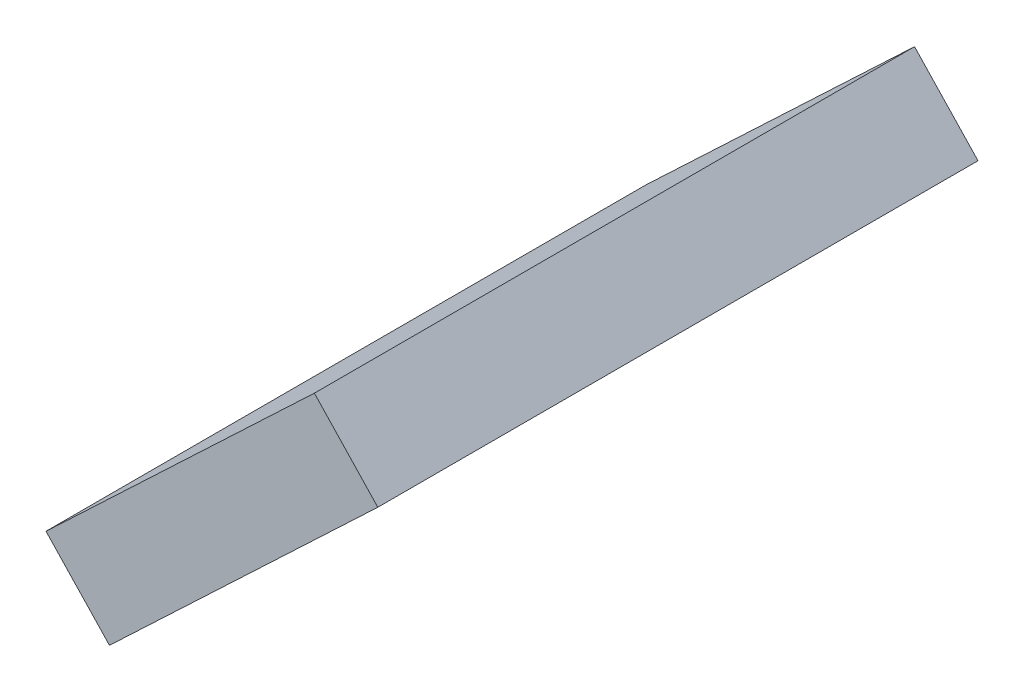
ISO-10303-21;
HEADER;
FILE_DESCRIPTION(('STEP AP214'),'2;1');
FILE_NAME('part.step','',(''),(''),'','','');
FILE_SCHEMA(('AUTOMOTIVE_DESIGN { 1 0 10303 214 1 1 1 1 }'));
ENDSEC;
DATA;
#1=APPLICATION_CONTEXT('core data for automotive mechanical design processes');
#2=APPLICATION_PROTOCOL_DEFINITION('international standard','automotive_design',2000,#1);
#3=PRODUCT_CONTEXT('',#1,'mechanical');
#4=PRODUCT('Part','Part','',(#3));
#5=PRODUCT_RELATED_PRODUCT_CATEGORY('part','',(#4));
#6=PRODUCT_DEFINITION_FORMATION('','',#4);
#7=PRODUCT_DEFINITION_CONTEXT('part definition',#1,'design');
#8=PRODUCT_DEFINITION('design','',#6,#7);
#9=PRODUCT_DEFINITION_SHAPE('','',#8);
#10=(LENGTH_UNIT() NAMED_UNIT(*) SI_UNIT(.MILLI.,.METRE.));
#11=(NAMED_UNIT(*) PLANE_ANGLE_UNIT() SI_UNIT($,.RADIAN.));
#12=(NAMED_UNIT(*) SI_UNIT($,.STERADIAN.) SOLID_ANGLE_UNIT());
#13=UNCERTAINTY_MEASURE_WITH_UNIT(LENGTH_MEASURE(1.E-05),#10,'distance_accuracy_value','');
#14=(GEOMETRIC_REPRESENTATION_CONTEXT(3) GLOBAL_UNCERTAINTY_ASSIGNED_CONTEXT((#13)) GLOBAL_UNIT_ASSIGNED_CONTEXT((#10,
#11,#12)) REPRESENTATION_CONTEXT('',''));
#15=CARTESIAN_POINT('',(0.,0.,0.));
#16=DIRECTION('',(0.,0.,1.));
#17=DIRECTION('',(1.,0.,0.));
#18=AXIS2_PLACEMENT_3D('',#15,#16,#17);
#19=CARTESIAN_POINT('',(-379.251734040544,-354.256359801674,130.));
#20=DIRECTION('',(0.726614577029218,0.687045308876096,0.));
#21=DIRECTION('',(-0.687045308876096,0.726614577029218,0.));
#22=AXIS2_PLACEMENT_3D('',#19,#20,#21);
#23=PLANE('',#22);
#24=DIRECTION('',(0.687045308876096,-0.726614577029218,0.));
#25=VECTOR('',#24,1.);
#26=CARTESIAN_POINT('',(-379.251734040544,-354.256359801674,0.));
#27=LINE('',#26,#25);
#28=CARTESIAN_POINT('',(-379.251734040544,-354.256359801674,0.));
#29=VERTEX_POINT('',#28);
#30=CARTESIAN_POINT('',(-365.510827863022,-368.788651342258,0.));
#31=VERTEX_POINT('',#30);
#32=EDGE_CURVE('E98',#29,#31,#27,.T.);
#33=ORIENTED_EDGE('',*,*,#32,.T.);
#34=DIRECTION('',(0.,0.,-1.));
#35=VECTOR('',#34,1.);
#36=CARTESIAN_POINT('',(-365.510827863022,-368.788651342258,130.));
#37=LINE('',#36,#35);
#38=CARTESIAN_POINT('',(-365.510827863022,-368.788651342258,130.));
#39=VERTEX_POINT('',#38);
#40=EDGE_CURVE('E11',#39,#31,#37,.T.);
#41=ORIENTED_EDGE('',*,*,#40,.F.);
#42=DIRECTION('',(0.687045308876096,-0.726614577029218,0.));
#43=VECTOR('',#42,1.);
#44=CARTESIAN_POINT('',(-379.251734040544,-354.256359801674,130.));
#45=LINE('',#44,#43);
#46=CARTESIAN_POINT('',(-379.251734040544,-354.256359801674,130.));
#47=VERTEX_POINT('',#46);
#48=EDGE_CURVE('E86',#47,#39,#45,.T.);
#49=ORIENTED_EDGE('',*,*,#48,.F.);
#50=DIRECTION('',(0.,0.,-1.));
#51=VECTOR('',#50,1.);
#52=CARTESIAN_POINT('',(-379.251734040544,-354.256359801674,130.));
#53=LINE('',#52,#51);
#54=EDGE_CURVE('E94',#47,#29,#53,.T.);
#55=ORIENTED_EDGE('',*,*,#54,.T.);
#56=EDGE_LOOP('',(#33,#41,#49,#55));
#57=FACE_BOUND('',#56,.T.);
#58=ADVANCED_FACE('F35',(#57),#23,.F.);
#59=CARTESIAN_POINT('',(-365.510827863022,-368.788651342258,130.));
#60=DIRECTION('',(-0.687045308876096,0.726614577029218,0.));
#61=DIRECTION('',(-0.726614577029218,-0.687045308876096,0.));
#62=AXIS2_PLACEMENT_3D('',#59,#60,#61);
#63=PLANE('',#62);
#64=DIRECTION('',(0.726614577029218,0.687045308876096,0.));
#65=VECTOR('',#64,1.);
#66=CARTESIAN_POINT('',(-365.510827863022,-368.788651342258,0.));
#67=LINE('',#66,#65);
#68=CARTESIAN_POINT('',(-307.381661700685,-313.82502663217,0.));
#69=VERTEX_POINT('',#68);
#70=EDGE_CURVE('E90',#31,#69,#67,.T.);
#71=ORIENTED_EDGE('',*,*,#70,.T.);
#72=DIRECTION('',(0.,0.,-1.));
#73=VECTOR('',#72,1.);
#74=CARTESIAN_POINT('',(-307.381661700685,-313.82502663217,130.));
#75=LINE('',#74,#73);
#76=CARTESIAN_POINT('',(-307.381661700685,-313.82502663217,130.));
#77=VERTEX_POINT('',#76);
#78=EDGE_CURVE('E43',#77,#69,#75,.T.);
#79=ORIENTED_EDGE('',*,*,#78,.F.);
#80=DIRECTION('',(0.726614577029218,0.687045308876096,0.));
#81=VECTOR('',#80,1.);
#82=CARTESIAN_POINT('',(-365.510827863022,-368.788651342258,130.));
#83=LINE('',#82,#81);
#84=EDGE_CURVE('E81',#39,#77,#83,.T.);
#85=ORIENTED_EDGE('',*,*,#84,.F.);
#86=ORIENTED_EDGE('',*,*,#40,.T.);
#87=EDGE_LOOP('',(#71,#79,#85,#86));
#88=FACE_BOUND('',#87,.T.);
#89=ADVANCED_FACE('F89',(#88),#63,.F.);
#90=CARTESIAN_POINT('',(-321.122567878206,-299.292735091586,130.));
#91=DIRECTION('',(-0.72661457702922,-0.687045308876094,0.));
#92=DIRECTION('',(0.687045308876095,-0.72661457702922,0.));
#93=AXIS2_PLACEMENT_3D('',#90,#91,#92);
#94=PLANE('',#93);
#95=DIRECTION('',(-0.687045308876095,0.72661457702922,0.));
#96=VECTOR('',#95,1.);
#97=CARTESIAN_POINT('',(-321.122567878206,-299.292735091586,0.));
#98=LINE('',#97,#96);
#99=CARTESIAN_POINT('',(-321.122567878206,-299.292735091586,0.));
#100=VERTEX_POINT('',#99);
#101=EDGE_CURVE('E68',#69,#100,#98,.T.);
#102=ORIENTED_EDGE('',*,*,#101,.T.);
#103=DIRECTION('',(0.,0.,-1.));
#104=VECTOR('',#103,1.);
#105=CARTESIAN_POINT('',(-321.122567878206,-299.292735091586,130.));
#106=LINE('',#105,#104);
#107=CARTESIAN_POINT('',(-321.122567878206,-299.292735091586,130.));
#108=VERTEX_POINT('',#107);
#109=EDGE_CURVE('E91',#108,#100,#106,.T.);
#110=ORIENTED_EDGE('',*,*,#109,.F.);
#111=DIRECTION('',(-0.687045308876095,0.72661457702922,0.));
#112=VECTOR('',#111,1.);
#113=CARTESIAN_POINT('',(-321.122567878206,-299.292735091586,130.));
#114=LINE('',#113,#112);
#115=EDGE_CURVE('E84',#77,#108,#114,.T.);
#116=ORIENTED_EDGE('',*,*,#115,.F.);
#117=ORIENTED_EDGE('',*,*,#78,.T.);
#118=EDGE_LOOP('',(#102,#110,#116,#117));
#119=FACE_BOUND('',#118,.T.);
#120=ADVANCED_FACE('F92',(#119),#94,.F.);
#121=CARTESIAN_POINT('',(-379.251734040544,-354.256359801674,130.));
#122=DIRECTION('',(0.687045308876096,-0.726614577029219,0.));
#123=DIRECTION('',(0.726614577029219,0.687045308876096,0.));
#124=AXIS2_PLACEMENT_3D('',#121,#122,#123);
#125=PLANE('',#124);
#126=DIRECTION('',(-0.726614577029219,-0.687045308876096,0.));
#127=VECTOR('',#126,1.);
#128=CARTESIAN_POINT('',(-379.251734040544,-354.256359801674,0.));
#129=LINE('',#128,#127);
#130=EDGE_CURVE('E74',#100,#29,#129,.T.);
#131=ORIENTED_EDGE('',*,*,#130,.T.);
#132=ORIENTED_EDGE('',*,*,#54,.F.);
#133=DIRECTION('',(-0.726614577029219,-0.687045308876096,0.));
#134=VECTOR('',#133,1.);
#135=CARTESIAN_POINT('',(-379.251734040544,-354.256359801674,130.));
#136=LINE('',#135,#134);
#137=EDGE_CURVE('E51',#108,#47,#136,.T.);
#138=ORIENTED_EDGE('',*,*,#137,.F.);
#139=ORIENTED_EDGE('',*,*,#109,.T.);
#140=EDGE_LOOP('',(#131,#132,#138,#139));
#141=FACE_BOUND('',#140,.T.);
#142=ADVANCED_FACE('F105',(#141),#125,.F.);
#143=CARTESIAN_POINT('',(0.,0.,130.));
#144=DIRECTION('',(0.,0.,1.));
#145=DIRECTION('',(1.,0.,0.));
#146=AXIS2_PLACEMENT_3D('',#143,#144,#145);
#147=PLANE('',#146);
#148=ORIENTED_EDGE('',*,*,#48,.T.);
#149=ORIENTED_EDGE('',*,*,#84,.T.);
#150=ORIENTED_EDGE('',*,*,#115,.T.);
#151=ORIENTED_EDGE('',*,*,#137,.T.);
#152=EDGE_LOOP('',(#148,#149,#150,#151));
#153=FACE_BOUND('',#152,.T.);
#154=ADVANCED_FACE('F82',(#153),#147,.T.);
#155=CARTESIAN_POINT('',(0.,0.,0.));
#156=DIRECTION('',(0.,0.,1.));
#157=DIRECTION('',(1.,0.,0.));
#158=AXIS2_PLACEMENT_3D('',#155,#156,#157);
#159=PLANE('',#158);
#160=ORIENTED_EDGE('',*,*,#32,.F.);
#161=ORIENTED_EDGE('',*,*,#130,.F.);
#162=ORIENTED_EDGE('',*,*,#101,.F.);
#163=ORIENTED_EDGE('',*,*,#70,.F.);
#164=EDGE_LOOP('',(#160,#161,#162,#163));
#165=FACE_BOUND('',#164,.T.);
#166=ADVANCED_FACE('F108',(#165),#159,.F.);
#167=CLOSED_SHELL('',(#58,#89,#120,#142,#154,#166));
#168=MANIFOLD_SOLID_BREP('B2',#167);
#169=ADVANCED_BREP_SHAPE_REPRESENTATION('',(#18,#168),#14);
#170=SHAPE_DEFINITION_REPRESENTATION(#9,#169);
ENDSEC;
END-ISO-10303-21;
